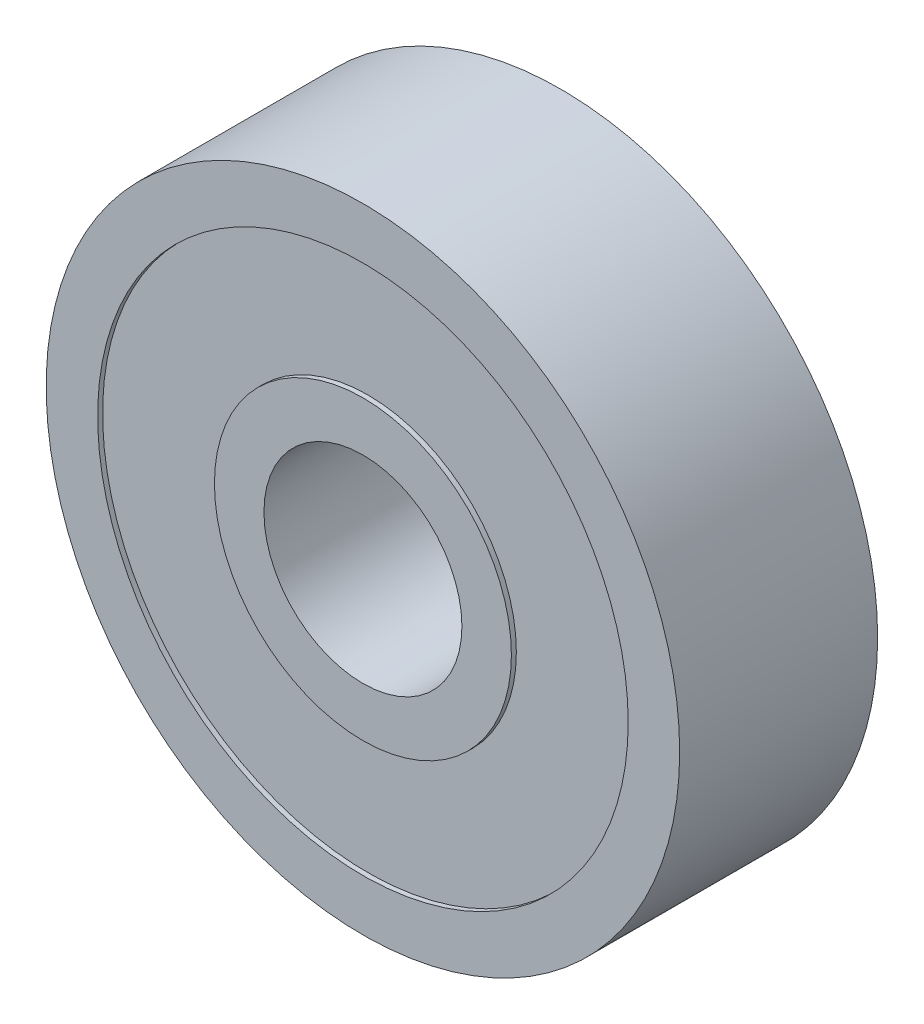
ISO-10303-21;
HEADER;
FILE_DESCRIPTION(('STEP AP214'),'2;1');
FILE_NAME('part.step','',(''),(''),'','','');
FILE_SCHEMA(('AUTOMOTIVE_DESIGN { 1 0 10303 214 1 1 1 1 }'));
ENDSEC;
DATA;
#1=APPLICATION_CONTEXT('core data for automotive mechanical design processes');
#2=APPLICATION_PROTOCOL_DEFINITION('international standard','automotive_design',2000,#1);
#3=PRODUCT_CONTEXT('',#1,'mechanical');
#4=PRODUCT('Part','Part','',(#3));
#5=PRODUCT_RELATED_PRODUCT_CATEGORY('part','',(#4));
#6=PRODUCT_DEFINITION_FORMATION('','',#4);
#7=PRODUCT_DEFINITION_CONTEXT('part definition',#1,'design');
#8=PRODUCT_DEFINITION('design','',#6,#7);
#9=PRODUCT_DEFINITION_SHAPE('','',#8);
#10=(LENGTH_UNIT() NAMED_UNIT(*) SI_UNIT(.MILLI.,.METRE.));
#11=(NAMED_UNIT(*) PLANE_ANGLE_UNIT() SI_UNIT($,.RADIAN.));
#12=(NAMED_UNIT(*) SI_UNIT($,.STERADIAN.) SOLID_ANGLE_UNIT());
#13=UNCERTAINTY_MEASURE_WITH_UNIT(LENGTH_MEASURE(1.E-05),#10,'distance_accuracy_value','');
#14=(GEOMETRIC_REPRESENTATION_CONTEXT(3) GLOBAL_UNCERTAINTY_ASSIGNED_CONTEXT((#13)) GLOBAL_UNIT_ASSIGNED_CONTEXT((#10,
#11,#12)) REPRESENTATION_CONTEXT('',''));
#15=CARTESIAN_POINT('',(0.,0.,0.));
#16=DIRECTION('',(0.,0.,1.));
#17=DIRECTION('',(1.,0.,0.));
#18=AXIS2_PLACEMENT_3D('',#15,#16,#17);
#19=CARTESIAN_POINT('',(0.,0.,-2.5));
#20=DIRECTION('',(0.,0.,1.));
#21=DIRECTION('',(1.,0.,0.));
#22=AXIS2_PLACEMENT_3D('',#19,#20,#21);
#23=CYLINDRICAL_SURFACE('',#22,3.75);
#24=CARTESIAN_POINT('',(0.,0.,-2.5));
#25=DIRECTION('',(0.,0.,1.));
#26=DIRECTION('',(1.,0.,0.));
#27=AXIS2_PLACEMENT_3D('',#24,#25,#26);
#28=CIRCLE('',#27,3.75);
#29=CARTESIAN_POINT('',(3.75,0.,-2.5));
#30=VERTEX_POINT('',#29);
#31=EDGE_CURVE('E53',#30,#30,#28,.T.);
#32=ORIENTED_EDGE('',*,*,#31,.T.);
#33=EDGE_LOOP('',(#32));
#34=FACE_BOUND('',#33,.T.);
#35=CARTESIAN_POINT('',(0.,0.,-2.375));
#36=DIRECTION('',(0.,0.,1.));
#37=DIRECTION('',(1.,0.,0.));
#38=AXIS2_PLACEMENT_3D('',#35,#36,#37);
#39=CIRCLE('',#38,3.75);
#40=CARTESIAN_POINT('',(3.75,0.,-2.375));
#41=VERTEX_POINT('',#40);
#42=EDGE_CURVE('E72',#41,#41,#39,.T.);
#43=ORIENTED_EDGE('',*,*,#42,.F.);
#44=EDGE_LOOP('',(#43));
#45=FACE_BOUND('',#44,.T.);
#46=ADVANCED_FACE('F46',(#34,#45),#23,.T.);
#47=CARTESIAN_POINT('',(0.,0.,-2.5));
#48=DIRECTION('',(0.,0.,1.));
#49=DIRECTION('',(1.,0.,0.));
#50=AXIS2_PLACEMENT_3D('',#47,#48,#49);
#51=CYLINDRICAL_SURFACE('',#50,2.5);
#52=CARTESIAN_POINT('',(0.,0.,-2.5));
#53=DIRECTION('',(0.,0.,1.));
#54=DIRECTION('',(1.,0.,0.));
#55=AXIS2_PLACEMENT_3D('',#52,#53,#54);
#56=CIRCLE('',#55,2.5);
#57=CARTESIAN_POINT('',(2.5,0.,-2.5));
#58=VERTEX_POINT('',#57);
#59=EDGE_CURVE('E57',#58,#58,#56,.T.);
#60=ORIENTED_EDGE('',*,*,#59,.F.);
#61=EDGE_LOOP('',(#60));
#62=FACE_BOUND('',#61,.T.);
#63=CARTESIAN_POINT('',(0.,0.,2.5));
#64=DIRECTION('',(0.,0.,1.));
#65=DIRECTION('',(1.,0.,0.));
#66=AXIS2_PLACEMENT_3D('',#63,#64,#65);
#67=CIRCLE('',#66,2.5);
#68=CARTESIAN_POINT('',(2.5,0.,2.5));
#69=VERTEX_POINT('',#68);
#70=EDGE_CURVE('E66',#69,#69,#67,.T.);
#71=ORIENTED_EDGE('',*,*,#70,.T.);
#72=EDGE_LOOP('',(#71));
#73=FACE_BOUND('',#72,.T.);
#74=ADVANCED_FACE('F48',(#62,#73),#51,.F.);
#75=CARTESIAN_POINT('',(0.,0.,2.375));
#76=DIRECTION('',(0.,0.,1.));
#77=DIRECTION('',(1.,0.,0.));
#78=AXIS2_PLACEMENT_3D('',#75,#76,#77);
#79=CIRCLE('',#78,3.75);
#80=CARTESIAN_POINT('',(3.75,0.,2.375));
#81=VERTEX_POINT('',#80);
#82=EDGE_CURVE('E11',#81,#81,#79,.F.);
#83=ORIENTED_EDGE('',*,*,#82,.F.);
#84=EDGE_LOOP('',(#83));
#85=FACE_BOUND('',#84,.T.);
#86=CARTESIAN_POINT('',(0.,0.,2.5));
#87=DIRECTION('',(0.,0.,1.));
#88=DIRECTION('',(1.,0.,0.));
#89=AXIS2_PLACEMENT_3D('',#86,#87,#88);
#90=CIRCLE('',#89,3.75);
#91=CARTESIAN_POINT('',(3.75,0.,2.5));
#92=VERTEX_POINT('',#91);
#93=EDGE_CURVE('E61',#92,#92,#90,.T.);
#94=ORIENTED_EDGE('',*,*,#93,.F.);
#95=EDGE_LOOP('',(#94));
#96=FACE_BOUND('',#95,.T.);
#97=ADVANCED_FACE('F114',(#85,#96),#23,.T.);
#98=CARTESIAN_POINT('',(0.,0.,-2.5));
#99=DIRECTION('',(0.,0.,1.));
#100=DIRECTION('',(1.,0.,0.));
#101=AXIS2_PLACEMENT_3D('',#98,#99,#100);
#102=PLANE('',#101);
#103=ORIENTED_EDGE('',*,*,#59,.T.);
#104=EDGE_LOOP('',(#103));
#105=FACE_BOUND('',#104,.T.);
#106=ORIENTED_EDGE('',*,*,#31,.F.);
#107=EDGE_LOOP('',(#106));
#108=FACE_BOUND('',#107,.T.);
#109=ADVANCED_FACE('F122',(#105,#108),#102,.F.);
#110=CARTESIAN_POINT('',(0.,0.,2.5));
#111=DIRECTION('',(0.,0.,1.));
#112=DIRECTION('',(1.,0.,0.));
#113=AXIS2_PLACEMENT_3D('',#110,#111,#112);
#114=PLANE('',#113);
#115=ORIENTED_EDGE('',*,*,#70,.F.);
#116=EDGE_LOOP('',(#115));
#117=FACE_BOUND('',#116,.T.);
#118=ORIENTED_EDGE('',*,*,#93,.T.);
#119=EDGE_LOOP('',(#118));
#120=FACE_BOUND('',#119,.T.);
#121=ADVANCED_FACE('F127',(#117,#120),#114,.T.);
#122=CARTESIAN_POINT('',(0.,0.,-2.375));
#123=DIRECTION('',(0.,0.,1.));
#124=DIRECTION('',(1.,0.,0.));
#125=AXIS2_PLACEMENT_3D('',#122,#123,#124);
#126=PLANE('',#125);
#127=ORIENTED_EDGE('',*,*,#42,.T.);
#128=EDGE_LOOP('',(#127));
#129=FACE_BOUND('',#128,.T.);
#130=CARTESIAN_POINT('',(0.,0.,-2.375));
#131=DIRECTION('',(0.,0.,1.));
#132=DIRECTION('',(1.,0.,0.));
#133=AXIS2_PLACEMENT_3D('',#130,#131,#132);
#134=CIRCLE('',#133,6.7);
#135=CARTESIAN_POINT('',(6.7,0.,-2.375));
#136=VERTEX_POINT('',#135);
#137=EDGE_CURVE('E69',#136,#136,#134,.T.);
#138=ORIENTED_EDGE('',*,*,#137,.F.);
#139=EDGE_LOOP('',(#138));
#140=FACE_BOUND('',#139,.T.);
#141=ADVANCED_FACE('F133',(#129,#140),#126,.F.);
#142=CARTESIAN_POINT('',(0.,0.,2.375));
#143=DIRECTION('',(0.,0.,1.));
#144=DIRECTION('',(1.,0.,0.));
#145=AXIS2_PLACEMENT_3D('',#142,#143,#144);
#146=PLANE('',#145);
#147=ORIENTED_EDGE('',*,*,#82,.T.);
#148=EDGE_LOOP('',(#147));
#149=FACE_BOUND('',#148,.T.);
#150=CARTESIAN_POINT('',(0.,0.,2.375));
#151=DIRECTION('',(0.,0.,1.));
#152=DIRECTION('',(1.,0.,0.));
#153=AXIS2_PLACEMENT_3D('',#150,#151,#152);
#154=CIRCLE('',#153,6.7);
#155=CARTESIAN_POINT('',(6.7,0.,2.375));
#156=VERTEX_POINT('',#155);
#157=EDGE_CURVE('E75',#156,#156,#154,.T.);
#158=ORIENTED_EDGE('',*,*,#157,.T.);
#159=EDGE_LOOP('',(#158));
#160=FACE_BOUND('',#159,.T.);
#161=ADVANCED_FACE('F139',(#149,#160),#146,.T.);
#162=CARTESIAN_POINT('',(0.,0.,-2.5));
#163=DIRECTION('',(0.,0.,1.));
#164=DIRECTION('',(1.,0.,0.));
#165=AXIS2_PLACEMENT_3D('',#162,#163,#164);
#166=CYLINDRICAL_SURFACE('',#165,6.7);
#167=CARTESIAN_POINT('',(0.,0.,-2.5));
#168=DIRECTION('',(0.,0.,1.));
#169=DIRECTION('',(1.,0.,0.));
#170=AXIS2_PLACEMENT_3D('',#167,#168,#169);
#171=CIRCLE('',#170,6.7);
#172=CARTESIAN_POINT('',(6.7,0.,-2.5));
#173=VERTEX_POINT('',#172);
#174=EDGE_CURVE('E81',#173,#173,#171,.T.);
#175=ORIENTED_EDGE('',*,*,#174,.F.);
#176=EDGE_LOOP('',(#175));
#177=FACE_BOUND('',#176,.T.);
#178=ORIENTED_EDGE('',*,*,#137,.T.);
#179=EDGE_LOOP('',(#178));
#180=FACE_BOUND('',#179,.T.);
#181=ADVANCED_FACE('F110',(#177,#180),#166,.F.);
#182=ORIENTED_EDGE('',*,*,#157,.F.);
#183=EDGE_LOOP('',(#182));
#184=FACE_BOUND('',#183,.T.);
#185=CARTESIAN_POINT('',(0.,0.,2.5));
#186=DIRECTION('',(0.,0.,1.));
#187=DIRECTION('',(1.,0.,0.));
#188=AXIS2_PLACEMENT_3D('',#185,#186,#187);
#189=CIRCLE('',#188,6.7);
#190=CARTESIAN_POINT('',(6.7,0.,2.5));
#191=VERTEX_POINT('',#190);
#192=EDGE_CURVE('E87',#191,#191,#189,.T.);
#193=ORIENTED_EDGE('',*,*,#192,.T.);
#194=EDGE_LOOP('',(#193));
#195=FACE_BOUND('',#194,.T.);
#196=ADVANCED_FACE('F91',(#184,#195),#166,.F.);
#197=CARTESIAN_POINT('',(0.,0.,-2.5));
#198=DIRECTION('',(0.,0.,1.));
#199=DIRECTION('',(1.,0.,0.));
#200=AXIS2_PLACEMENT_3D('',#197,#198,#199);
#201=CYLINDRICAL_SURFACE('',#200,8.);
#202=CARTESIAN_POINT('',(0.,0.,-2.5));
#203=DIRECTION('',(0.,0.,1.));
#204=DIRECTION('',(1.,0.,0.));
#205=AXIS2_PLACEMENT_3D('',#202,#203,#204);
#206=CIRCLE('',#205,8.);
#207=CARTESIAN_POINT('',(8.,0.,-2.5));
#208=VERTEX_POINT('',#207);
#209=EDGE_CURVE('E78',#208,#208,#206,.T.);
#210=ORIENTED_EDGE('',*,*,#209,.T.);
#211=EDGE_LOOP('',(#210));
#212=FACE_BOUND('',#211,.T.);
#213=CARTESIAN_POINT('',(0.,0.,2.5));
#214=DIRECTION('',(0.,0.,1.));
#215=DIRECTION('',(1.,0.,0.));
#216=AXIS2_PLACEMENT_3D('',#213,#214,#215);
#217=CIRCLE('',#216,8.);
#218=CARTESIAN_POINT('',(8.,0.,2.5));
#219=VERTEX_POINT('',#218);
#220=EDGE_CURVE('E84',#219,#219,#217,.T.);
#221=ORIENTED_EDGE('',*,*,#220,.F.);
#222=EDGE_LOOP('',(#221));
#223=FACE_BOUND('',#222,.T.);
#224=ADVANCED_FACE('F100',(#212,#223),#201,.T.);
#225=CARTESIAN_POINT('',(0.,0.,-2.5));
#226=DIRECTION('',(0.,0.,1.));
#227=DIRECTION('',(1.,0.,0.));
#228=AXIS2_PLACEMENT_3D('',#225,#226,#227);
#229=PLANE('',#228);
#230=ORIENTED_EDGE('',*,*,#174,.T.);
#231=EDGE_LOOP('',(#230));
#232=FACE_BOUND('',#231,.T.);
#233=ORIENTED_EDGE('',*,*,#209,.F.);
#234=EDGE_LOOP('',(#233));
#235=FACE_BOUND('',#234,.T.);
#236=ADVANCED_FACE('F96',(#232,#235),#229,.F.);
#237=CARTESIAN_POINT('',(0.,0.,2.5));
#238=DIRECTION('',(0.,0.,1.));
#239=DIRECTION('',(1.,0.,0.));
#240=AXIS2_PLACEMENT_3D('',#237,#238,#239);
#241=PLANE('',#240);
#242=ORIENTED_EDGE('',*,*,#192,.F.);
#243=EDGE_LOOP('',(#242));
#244=FACE_BOUND('',#243,.T.);
#245=ORIENTED_EDGE('',*,*,#220,.T.);
#246=EDGE_LOOP('',(#245));
#247=FACE_BOUND('',#246,.T.);
#248=ADVANCED_FACE('F93',(#244,#247),#241,.T.);
#249=CLOSED_SHELL('',(#46,#74,#97,#109,#121,#141,#161,#181,#196,#224,#236,#248));
#250=MANIFOLD_SOLID_BREP('B2',#249);
#251=ADVANCED_BREP_SHAPE_REPRESENTATION('',(#18,#250),#14);
#252=SHAPE_DEFINITION_REPRESENTATION(#9,#251);
ENDSEC;
END-ISO-10303-21;
